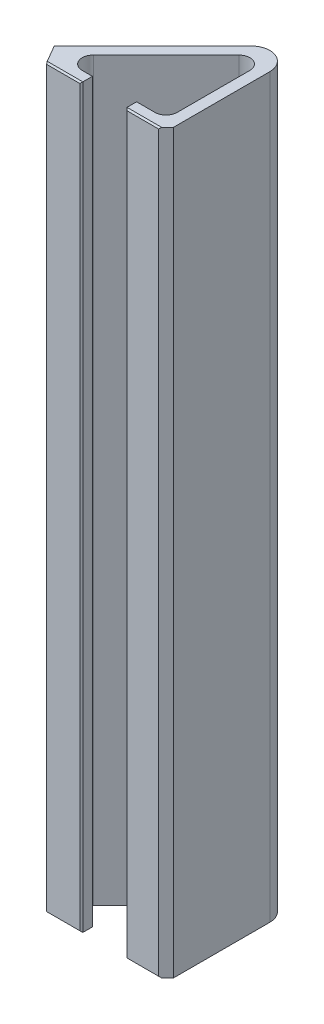
ISO-10303-21;
HEADER;
FILE_DESCRIPTION(('STEP AP214'),'2;1');
FILE_NAME('part.step','',(''),(''),'','','');
FILE_SCHEMA(('AUTOMOTIVE_DESIGN { 1 0 10303 214 1 1 1 1 }'));
ENDSEC;
DATA;
#1=APPLICATION_CONTEXT('core data for automotive mechanical design processes');
#2=APPLICATION_PROTOCOL_DEFINITION('international standard','automotive_design',2000,#1);
#3=PRODUCT_CONTEXT('',#1,'mechanical');
#4=PRODUCT('Part','Part','',(#3));
#5=PRODUCT_RELATED_PRODUCT_CATEGORY('part','',(#4));
#6=PRODUCT_DEFINITION_FORMATION('','',#4);
#7=PRODUCT_DEFINITION_CONTEXT('part definition',#1,'design');
#8=PRODUCT_DEFINITION('design','',#6,#7);
#9=PRODUCT_DEFINITION_SHAPE('','',#8);
#10=(LENGTH_UNIT() NAMED_UNIT(*) SI_UNIT(.MILLI.,.METRE.));
#11=(NAMED_UNIT(*) PLANE_ANGLE_UNIT() SI_UNIT($,.RADIAN.));
#12=(NAMED_UNIT(*) SI_UNIT($,.STERADIAN.) SOLID_ANGLE_UNIT());
#13=UNCERTAINTY_MEASURE_WITH_UNIT(LENGTH_MEASURE(1.E-05),#10,'distance_accuracy_value','');
#14=(GEOMETRIC_REPRESENTATION_CONTEXT(3) GLOBAL_UNCERTAINTY_ASSIGNED_CONTEXT((#13)) GLOBAL_UNIT_ASSIGNED_CONTEXT((#10,
#11,#12)) REPRESENTATION_CONTEXT('',''));
#15=CARTESIAN_POINT('',(0.,0.,0.));
#16=DIRECTION('',(0.,0.,1.));
#17=DIRECTION('',(1.,0.,0.));
#18=AXIS2_PLACEMENT_3D('',#15,#16,#17);
#19=CARTESIAN_POINT('',(-8.,200.,0.));
#20=DIRECTION('',(0.,0.,1.));
#21=DIRECTION('',(1.,0.,0.));
#22=AXIS2_PLACEMENT_3D('',#19,#20,#21);
#23=PLANE('',#22);
#24=DIRECTION('',(-1.,0.,0.));
#25=VECTOR('',#24,1.);
#26=CARTESIAN_POINT('',(-8.,200.,0.));
#27=LINE('',#26,#25);
#28=CARTESIAN_POINT('',(-3.,200.,0.));
#29=VERTEX_POINT('',#28);
#30=CARTESIAN_POINT('',(-8.,200.,0.));
#31=VERTEX_POINT('',#30);
#32=EDGE_CURVE('E177',#29,#31,#27,.T.);
#33=ORIENTED_EDGE('',*,*,#32,.F.);
#34=DIRECTION('',(0.,-1.,0.));
#35=VECTOR('',#34,1.);
#36=CARTESIAN_POINT('',(-3.,0.,0.));
#37=LINE('',#36,#35);
#38=CARTESIAN_POINT('',(-3.,0.,0.));
#39=VERTEX_POINT('',#38);
#40=EDGE_CURVE('E203',#29,#39,#37,.T.);
#41=ORIENTED_EDGE('',*,*,#40,.T.);
#42=DIRECTION('',(-1.,0.,0.));
#43=VECTOR('',#42,1.);
#44=CARTESIAN_POINT('',(-8.,0.,0.));
#45=LINE('',#44,#43);
#46=CARTESIAN_POINT('',(-8.,0.,0.));
#47=VERTEX_POINT('',#46);
#48=EDGE_CURVE('E201',#39,#47,#45,.T.);
#49=ORIENTED_EDGE('',*,*,#48,.T.);
#50=DIRECTION('',(0.,-1.,0.));
#51=VECTOR('',#50,1.);
#52=CARTESIAN_POINT('',(-8.,200.,0.));
#53=LINE('',#52,#51);
#54=EDGE_CURVE('E195',#31,#47,#53,.T.);
#55=ORIENTED_EDGE('',*,*,#54,.F.);
#56=EDGE_LOOP('',(#33,#41,#49,#55));
#57=FACE_BOUND('',#56,.T.);
#58=ADVANCED_FACE('F36',(#57),#23,.F.);
#59=CARTESIAN_POINT('',(-8.,200.,0.));
#60=DIRECTION('',(1.,0.,0.));
#61=DIRECTION('',(0.,0.,-1.));
#62=AXIS2_PLACEMENT_3D('',#59,#60,#61);
#63=PLANE('',#62);
#64=DIRECTION('',(0.,0.,1.));
#65=VECTOR('',#64,1.);
#66=CARTESIAN_POINT('',(-8.,0.,0.));
#67=LINE('',#66,#65);
#68=CARTESIAN_POINT('',(-8.,0.,2.59999999999999));
#69=VERTEX_POINT('',#68);
#70=EDGE_CURVE('E346',#47,#69,#67,.T.);
#71=ORIENTED_EDGE('',*,*,#70,.T.);
#72=DIRECTION('',(0.,1.,0.));
#73=VECTOR('',#72,1.);
#74=CARTESIAN_POINT('',(-8.,200.,2.59999999999999));
#75=LINE('',#74,#73);
#76=CARTESIAN_POINT('',(-8.,200.,2.59999999999999));
#77=VERTEX_POINT('',#76);
#78=EDGE_CURVE('E197',#69,#77,#75,.T.);
#79=ORIENTED_EDGE('',*,*,#78,.T.);
#80=DIRECTION('',(0.,0.,1.));
#81=VECTOR('',#80,1.);
#82=CARTESIAN_POINT('',(-8.,200.,0.));
#83=LINE('',#82,#81);
#84=EDGE_CURVE('E180',#31,#77,#83,.T.);
#85=ORIENTED_EDGE('',*,*,#84,.F.);
#86=ORIENTED_EDGE('',*,*,#54,.T.);
#87=EDGE_LOOP('',(#71,#79,#85,#86));
#88=FACE_BOUND('',#87,.T.);
#89=ADVANCED_FACE('F194',(#88),#63,.F.);
#90=CARTESIAN_POINT('',(-8.,200.,3.));
#91=DIRECTION('',(0.,0.,-1.));
#92=DIRECTION('',(-1.,0.,0.));
#93=AXIS2_PLACEMENT_3D('',#90,#91,#92);
#94=PLANE('',#93);
#95=DIRECTION('',(0.,-1.,0.));
#96=VECTOR('',#95,1.);
#97=CARTESIAN_POINT('',(-7.59999999999999,200.,3.));
#98=LINE('',#97,#96);
#99=CARTESIAN_POINT('',(-7.59999999999999,199.6,3.));
#100=VERTEX_POINT('',#99);
#101=CARTESIAN_POINT('',(-7.59999999999999,0.400000000000011,3.));
#102=VERTEX_POINT('',#101);
#103=EDGE_CURVE('E267',#100,#102,#98,.T.);
#104=ORIENTED_EDGE('',*,*,#103,.T.);
#105=DIRECTION('',(1.,0.,0.));
#106=VECTOR('',#105,1.);
#107=CARTESIAN_POINT('',(-8.,0.400000000000011,3.));
#108=LINE('',#107,#106);
#109=CARTESIAN_POINT('',(0.999999999999997,0.400000000000011,3.));
#110=VERTEX_POINT('',#109);
#111=EDGE_CURVE('E271',#102,#110,#108,.T.);
#112=ORIENTED_EDGE('',*,*,#111,.T.);
#113=DIRECTION('',(0.,1.,0.));
#114=VECTOR('',#113,1.);
#115=CARTESIAN_POINT('',(0.999999999999997,200.,3.));
#116=LINE('',#115,#114);
#117=CARTESIAN_POINT('',(0.999999999999997,199.6,3.));
#118=VERTEX_POINT('',#117);
#119=EDGE_CURVE('E262',#110,#118,#116,.T.);
#120=ORIENTED_EDGE('',*,*,#119,.T.);
#121=DIRECTION('',(-1.,0.,0.));
#122=VECTOR('',#121,1.);
#123=CARTESIAN_POINT('',(-8.,199.6,3.));
#124=LINE('',#123,#122);
#125=EDGE_CURVE('E269',#118,#100,#124,.T.);
#126=ORIENTED_EDGE('',*,*,#125,.T.);
#127=EDGE_LOOP('',(#104,#112,#120,#126));
#128=FACE_BOUND('',#127,.T.);
#129=ADVANCED_FACE('F406',(#128),#94,.F.);
#130=CARTESIAN_POINT('',(3.,200.,3.));
#131=DIRECTION('',(-1.,0.,0.));
#132=DIRECTION('',(0.,0.,1.));
#133=AXIS2_PLACEMENT_3D('',#130,#131,#132);
#134=PLANE('',#133);
#135=DIRECTION('',(0.,0.,-1.));
#136=VECTOR('',#135,1.);
#137=CARTESIAN_POINT('',(3.,200.,3.));
#138=LINE('',#137,#136);
#139=CARTESIAN_POINT('',(3.,200.,0.999999999999998));
#140=VERTEX_POINT('',#139);
#141=CARTESIAN_POINT('',(3.,200.,-25.1715728752538));
#142=VERTEX_POINT('',#141);
#143=EDGE_CURVE('E198',#140,#142,#138,.T.);
#144=ORIENTED_EDGE('',*,*,#143,.F.);
#145=DIRECTION('',(0.,-1.,0.));
#146=VECTOR('',#145,1.);
#147=CARTESIAN_POINT('',(3.,200.,0.999999999999998));
#148=LINE('',#147,#146);
#149=CARTESIAN_POINT('',(3.,0.,0.999999999999998));
#150=VERTEX_POINT('',#149);
#151=EDGE_CURVE('E256',#140,#150,#148,.T.);
#152=ORIENTED_EDGE('',*,*,#151,.T.);
#153=DIRECTION('',(0.,0.,-1.));
#154=VECTOR('',#153,1.);
#155=CARTESIAN_POINT('',(3.,0.,3.));
#156=LINE('',#155,#154);
#157=CARTESIAN_POINT('',(3.,0.,-25.1715728752538));
#158=VERTEX_POINT('',#157);
#159=EDGE_CURVE('E332',#150,#158,#156,.T.);
#160=ORIENTED_EDGE('',*,*,#159,.T.);
#161=DIRECTION('',(0.,-1.,0.));
#162=VECTOR('',#161,1.);
#163=CARTESIAN_POINT('',(3.,200.,-25.1715728752538));
#164=LINE('',#163,#162);
#165=EDGE_CURVE('E241',#158,#142,#164,.F.);
#166=ORIENTED_EDGE('',*,*,#165,.T.);
#167=EDGE_LOOP('',(#144,#152,#160,#166));
#168=FACE_BOUND('',#167,.T.);
#169=ADVANCED_FACE('F354',(#168),#134,.F.);
#170=CARTESIAN_POINT('',(3.,200.,-37.2426406871193));
#171=DIRECTION('',(0.707106781186548,0.,0.707106781186548));
#172=DIRECTION('',(0.707106781186548,0.,-0.707106781186548));
#173=AXIS2_PLACEMENT_3D('',#170,#171,#172);
#174=PLANE('',#173);
#175=DIRECTION('',(-0.707106781186548,0.,0.707106781186548));
#176=VECTOR('',#175,1.);
#177=CARTESIAN_POINT('',(3.,0.,-37.2426406871193));
#178=LINE('',#177,#176);
#179=CARTESIAN_POINT('',(-5.53553390593274,0.,-28.7071067811865));
#180=VERTEX_POINT('',#179);
#181=CARTESIAN_POINT('',(-32.2928932188134,0.,-1.94974746830583));
#182=VERTEX_POINT('',#181);
#183=EDGE_CURVE('E328',#180,#182,#178,.T.);
#184=ORIENTED_EDGE('',*,*,#183,.T.);
#185=DIRECTION('',(0.,1.,0.));
#186=VECTOR('',#185,1.);
#187=CARTESIAN_POINT('',(-32.2928932188134,200.,-1.94974746830584));
#188=LINE('',#187,#186);
#189=CARTESIAN_POINT('',(-32.2928932188134,200.,-1.94974746830583));
#190=VERTEX_POINT('',#189);
#191=EDGE_CURVE('E251',#182,#190,#188,.T.);
#192=ORIENTED_EDGE('',*,*,#191,.T.);
#193=DIRECTION('',(-0.707106781186548,0.,0.707106781186548));
#194=VECTOR('',#193,1.);
#195=CARTESIAN_POINT('',(3.,200.,-37.2426406871193));
#196=LINE('',#195,#194);
#197=CARTESIAN_POINT('',(-5.53553390593274,200.,-28.7071067811865));
#198=VERTEX_POINT('',#197);
#199=EDGE_CURVE('E363',#198,#190,#196,.T.);
#200=ORIENTED_EDGE('',*,*,#199,.F.);
#201=DIRECTION('',(0.,-1.,0.));
#202=VECTOR('',#201,1.);
#203=CARTESIAN_POINT('',(-5.53553390593274,200.,-28.7071067811865));
#204=LINE('',#203,#202);
#205=EDGE_CURVE('E235',#198,#180,#204,.T.);
#206=ORIENTED_EDGE('',*,*,#205,.T.);
#207=EDGE_LOOP('',(#184,#192,#200,#206));
#208=FACE_BOUND('',#207,.T.);
#209=ADVANCED_FACE('F365',(#208),#174,.F.);
#210=CARTESIAN_POINT('',(-37.2426406871193,200.,3.));
#211=DIRECTION('',(0.,0.,-1.));
#212=DIRECTION('',(-1.,0.,0.));
#213=AXIS2_PLACEMENT_3D('',#210,#211,#212);
#214=PLANE('',#213);
#215=DIRECTION('',(0.,-1.,0.));
#216=VECTOR('',#215,1.);
#217=CARTESIAN_POINT('',(-29.4351551855664,200.,3.));
#218=LINE('',#217,#216);
#219=CARTESIAN_POINT('',(-29.4351551855664,199.6,3.));
#220=VERTEX_POINT('',#219);
#221=CARTESIAN_POINT('',(-29.4351551855664,0.400000000000011,3.));
#222=VERTEX_POINT('',#221);
#223=EDGE_CURVE('E246',#220,#222,#218,.T.);
#224=ORIENTED_EDGE('',*,*,#223,.T.);
#225=DIRECTION('',(1.,0.,0.));
#226=VECTOR('',#225,1.);
#227=CARTESIAN_POINT('',(-37.2426406871193,0.400000000000011,3.));
#228=LINE('',#227,#226);
#229=CARTESIAN_POINT('',(-20.4,0.400000000000011,3.));
#230=VERTEX_POINT('',#229);
#231=EDGE_CURVE('E290',#222,#230,#228,.T.);
#232=ORIENTED_EDGE('',*,*,#231,.T.);
#233=DIRECTION('',(0.,1.,0.));
#234=VECTOR('',#233,1.);
#235=CARTESIAN_POINT('',(-20.4,200.,3.));
#236=LINE('',#235,#234);
#237=CARTESIAN_POINT('',(-20.4,199.6,3.));
#238=VERTEX_POINT('',#237);
#239=EDGE_CURVE('E54',#230,#238,#236,.T.);
#240=ORIENTED_EDGE('',*,*,#239,.T.);
#241=DIRECTION('',(-1.,0.,0.));
#242=VECTOR('',#241,1.);
#243=CARTESIAN_POINT('',(-29.4351551855664,199.6,3.));
#244=LINE('',#243,#242);
#245=EDGE_CURVE('E288',#238,#220,#244,.T.);
#246=ORIENTED_EDGE('',*,*,#245,.T.);
#247=EDGE_LOOP('',(#224,#232,#240,#246));
#248=FACE_BOUND('',#247,.T.);
#249=ADVANCED_FACE('F309',(#248),#214,.F.);
#250=CARTESIAN_POINT('',(-20.,200.,0.));
#251=DIRECTION('',(-1.,0.,0.));
#252=DIRECTION('',(0.,0.,1.));
#253=AXIS2_PLACEMENT_3D('',#250,#251,#252);
#254=PLANE('',#253);
#255=DIRECTION('',(0.,0.,-1.));
#256=VECTOR('',#255,1.);
#257=CARTESIAN_POINT('',(-20.,200.,0.));
#258=LINE('',#257,#256);
#259=CARTESIAN_POINT('',(-20.,200.,2.60000000000002));
#260=VERTEX_POINT('',#259);
#261=CARTESIAN_POINT('',(-20.,200.,0.));
#262=VERTEX_POINT('',#261);
#263=EDGE_CURVE('E366',#260,#262,#258,.T.);
#264=ORIENTED_EDGE('',*,*,#263,.F.);
#265=DIRECTION('',(0.,-1.,0.));
#266=VECTOR('',#265,1.);
#267=CARTESIAN_POINT('',(-20.,200.,2.60000000000002));
#268=LINE('',#267,#266);
#269=CARTESIAN_POINT('',(-20.,0.,2.60000000000002));
#270=VERTEX_POINT('',#269);
#271=EDGE_CURVE('E11',#260,#270,#268,.T.);
#272=ORIENTED_EDGE('',*,*,#271,.T.);
#273=DIRECTION('',(0.,0.,-1.));
#274=VECTOR('',#273,1.);
#275=CARTESIAN_POINT('',(-20.,0.,0.));
#276=LINE('',#275,#274);
#277=CARTESIAN_POINT('',(-20.,0.,0.));
#278=VERTEX_POINT('',#277);
#279=EDGE_CURVE('E323',#270,#278,#276,.T.);
#280=ORIENTED_EDGE('',*,*,#279,.T.);
#281=DIRECTION('',(0.,-1.,0.));
#282=VECTOR('',#281,1.);
#283=CARTESIAN_POINT('',(-20.,200.,0.));
#284=LINE('',#283,#282);
#285=EDGE_CURVE('E204',#262,#278,#284,.T.);
#286=ORIENTED_EDGE('',*,*,#285,.F.);
#287=EDGE_LOOP('',(#264,#272,#280,#286));
#288=FACE_BOUND('',#287,.T.);
#289=ADVANCED_FACE('F392',(#288),#254,.F.);
#290=CARTESIAN_POINT('',(-30.,200.,0.));
#291=DIRECTION('',(0.,0.,1.));
#292=DIRECTION('',(1.,0.,0.));
#293=AXIS2_PLACEMENT_3D('',#290,#291,#292);
#294=PLANE('',#293);
#295=DIRECTION('',(-1.,0.,0.));
#296=VECTOR('',#295,1.);
#297=CARTESIAN_POINT('',(-30.,0.,0.));
#298=LINE('',#297,#296);
#299=CARTESIAN_POINT('',(-22.7573593128807,0.,0.));
#300=VERTEX_POINT('',#299);
#301=EDGE_CURVE('E325',#278,#300,#298,.T.);
#302=ORIENTED_EDGE('',*,*,#301,.T.);
#303=DIRECTION('',(0.,-1.,0.));
#304=VECTOR('',#303,1.);
#305=CARTESIAN_POINT('',(-22.7573593128807,200.,0.));
#306=LINE('',#305,#304);
#307=CARTESIAN_POINT('',(-22.7573593128807,200.,0.));
#308=VERTEX_POINT('',#307);
#309=EDGE_CURVE('E222',#300,#308,#306,.F.);
#310=ORIENTED_EDGE('',*,*,#309,.T.);
#311=DIRECTION('',(-1.,0.,0.));
#312=VECTOR('',#311,1.);
#313=CARTESIAN_POINT('',(-30.,200.,0.));
#314=LINE('',#313,#312);
#315=EDGE_CURVE('E368',#262,#308,#314,.T.);
#316=ORIENTED_EDGE('',*,*,#315,.F.);
#317=ORIENTED_EDGE('',*,*,#285,.T.);
#318=EDGE_LOOP('',(#302,#310,#316,#317));
#319=FACE_BOUND('',#318,.T.);
#320=ADVANCED_FACE('F389',(#319),#294,.F.);
#321=CARTESIAN_POINT('',(0.,200.,-30.));
#322=DIRECTION('',(-0.707106781186547,0.,-0.707106781186547));
#323=DIRECTION('',(-0.707106781186548,0.,0.707106781186548));
#324=AXIS2_PLACEMENT_3D('',#321,#322,#323);
#325=PLANE('',#324);
#326=DIRECTION('',(0.707106781186547,0.,-0.707106781186547));
#327=VECTOR('',#326,1.);
#328=CARTESIAN_POINT('',(0.,200.,-30.));
#329=LINE('',#328,#327);
#330=CARTESIAN_POINT('',(-24.8786796564404,200.,-5.12132034355965));
#331=VERTEX_POINT('',#330);
#332=CARTESIAN_POINT('',(-5.12132034355964,200.,-24.8786796564404));
#333=VERTEX_POINT('',#332);
#334=EDGE_CURVE('E373',#331,#333,#329,.T.);
#335=ORIENTED_EDGE('',*,*,#334,.F.);
#336=DIRECTION('',(0.,-1.,0.));
#337=VECTOR('',#336,1.);
#338=CARTESIAN_POINT('',(-24.8786796564404,0.,-5.12132034355964));
#339=LINE('',#338,#337);
#340=CARTESIAN_POINT('',(-24.8786796564404,0.,-5.12132034355965));
#341=VERTEX_POINT('',#340);
#342=EDGE_CURVE('E219',#331,#341,#339,.T.);
#343=ORIENTED_EDGE('',*,*,#342,.T.);
#344=DIRECTION('',(0.707106781186547,0.,-0.707106781186547));
#345=VECTOR('',#344,1.);
#346=CARTESIAN_POINT('',(0.,0.,-30.));
#347=LINE('',#346,#345);
#348=CARTESIAN_POINT('',(-5.12132034355964,0.,-24.8786796564404));
#349=VERTEX_POINT('',#348);
#350=EDGE_CURVE('E330',#341,#349,#347,.T.);
#351=ORIENTED_EDGE('',*,*,#350,.T.);
#352=DIRECTION('',(0.,-1.,0.));
#353=VECTOR('',#352,1.);
#354=CARTESIAN_POINT('',(-5.12132034355964,200.,-24.8786796564404));
#355=LINE('',#354,#353);
#356=EDGE_CURVE('E217',#349,#333,#355,.F.);
#357=ORIENTED_EDGE('',*,*,#356,.T.);
#358=EDGE_LOOP('',(#335,#343,#351,#357));
#359=FACE_BOUND('',#358,.T.);
#360=ADVANCED_FACE('F382',(#359),#325,.F.);
#361=CARTESIAN_POINT('',(0.,200.,0.));
#362=DIRECTION('',(1.,0.,0.));
#363=DIRECTION('',(0.,0.,-1.));
#364=AXIS2_PLACEMENT_3D('',#361,#362,#363);
#365=PLANE('',#364);
#366=DIRECTION('',(0.,0.,1.));
#367=VECTOR('',#366,1.);
#368=CARTESIAN_POINT('',(0.,0.,0.));
#369=LINE('',#368,#367);
#370=CARTESIAN_POINT('',(0.,0.,-22.7573593128807));
#371=VERTEX_POINT('',#370);
#372=CARTESIAN_POINT('',(0.,0.,-3.));
#373=VERTEX_POINT('',#372);
#374=EDGE_CURVE('E189',#371,#373,#369,.T.);
#375=ORIENTED_EDGE('',*,*,#374,.T.);
#376=DIRECTION('',(0.,-1.,0.));
#377=VECTOR('',#376,1.);
#378=CARTESIAN_POINT('',(0.,200.,-3.));
#379=LINE('',#378,#377);
#380=CARTESIAN_POINT('',(0.,200.,-3.));
#381=VERTEX_POINT('',#380);
#382=EDGE_CURVE('E215',#373,#381,#379,.F.);
#383=ORIENTED_EDGE('',*,*,#382,.T.);
#384=DIRECTION('',(0.,0.,1.));
#385=VECTOR('',#384,1.);
#386=CARTESIAN_POINT('',(0.,200.,0.));
#387=LINE('',#386,#385);
#388=CARTESIAN_POINT('',(0.,200.,-22.7573593128807));
#389=VERTEX_POINT('',#388);
#390=EDGE_CURVE('E209',#389,#381,#387,.T.);
#391=ORIENTED_EDGE('',*,*,#390,.F.);
#392=DIRECTION('',(0.,-1.,0.));
#393=VECTOR('',#392,1.);
#394=CARTESIAN_POINT('',(0.,0.,-22.7573593128807));
#395=LINE('',#394,#393);
#396=EDGE_CURVE('E206',#389,#371,#395,.T.);
#397=ORIENTED_EDGE('',*,*,#396,.T.);
#398=EDGE_LOOP('',(#375,#383,#391,#397));
#399=FACE_BOUND('',#398,.T.);
#400=ADVANCED_FACE('F341',(#399),#365,.F.);
#401=CARTESIAN_POINT('',(0.,200.,0.));
#402=DIRECTION('',(0.,1.,0.));
#403=DIRECTION('',(0.,0.,1.));
#404=AXIS2_PLACEMENT_3D('',#401,#402,#403);
#405=PLANE('',#404);
#406=ORIENTED_EDGE('',*,*,#84,.T.);
#407=DIRECTION('',(1.,0.,0.));
#408=VECTOR('',#407,1.);
#409=CARTESIAN_POINT('',(0.999999999999997,200.,2.59999999999999));
#410=LINE('',#409,#408);
#411=CARTESIAN_POINT('',(1.40000000000001,200.,2.59999999999999));
#412=VERTEX_POINT('',#411);
#413=EDGE_CURVE('E284',#77,#412,#410,.T.);
#414=ORIENTED_EDGE('',*,*,#413,.T.);
#415=DIRECTION('',(-0.707106781186548,0.,0.707106781186547));
#416=VECTOR('',#415,1.);
#417=CARTESIAN_POINT('',(2.,200.,2.));
#418=LINE('',#417,#416);
#419=EDGE_CURVE('E265',#412,#140,#418,.F.);
#420=ORIENTED_EDGE('',*,*,#419,.T.);
#421=ORIENTED_EDGE('',*,*,#143,.T.);
#422=CARTESIAN_POINT('',(-2.,200.,-25.1715728752538));
#423=DIRECTION('',(0.,1.,0.));
#424=DIRECTION('',(0.,0.,1.));
#425=AXIS2_PLACEMENT_3D('',#422,#423,#424);
#426=CIRCLE('',#425,5.);
#427=EDGE_CURVE('E244',#142,#198,#426,.T.);
#428=ORIENTED_EDGE('',*,*,#427,.T.);
#429=ORIENTED_EDGE('',*,*,#199,.T.);
#430=DIRECTION('',(-0.5,0.,-0.866025403784439));
#431=VECTOR('',#430,1.);
#432=CARTESIAN_POINT('',(-23.3754044948514,200.,13.4957960775189));
#433=LINE('',#432,#431);
#434=CARTESIAN_POINT('',(-29.6660952932422,200.,2.60000000000002));
#435=VERTEX_POINT('',#434);
#436=EDGE_CURVE('E253',#190,#435,#433,.F.);
#437=ORIENTED_EDGE('',*,*,#436,.T.);
#438=DIRECTION('',(1.,0.,0.));
#439=VECTOR('',#438,1.);
#440=CARTESIAN_POINT('',(-20.,200.,2.60000000000002));
#441=LINE('',#440,#439);
#442=EDGE_CURVE('E282',#435,#260,#441,.T.);
#443=ORIENTED_EDGE('',*,*,#442,.T.);
#444=ORIENTED_EDGE('',*,*,#263,.T.);
#445=ORIENTED_EDGE('',*,*,#315,.T.);
#446=CARTESIAN_POINT('',(-22.7573593128807,200.,-3.));
#447=DIRECTION('',(0.,1.,0.));
#448=DIRECTION('',(0.,0.,1.));
#449=AXIS2_PLACEMENT_3D('',#446,#447,#448);
#450=CIRCLE('',#449,3.);
#451=EDGE_CURVE('E229',#308,#331,#450,.F.);
#452=ORIENTED_EDGE('',*,*,#451,.T.);
#453=ORIENTED_EDGE('',*,*,#334,.T.);
#454=CARTESIAN_POINT('',(-3.,200.,-22.7573593128807));
#455=DIRECTION('',(0.,1.,0.));
#456=DIRECTION('',(0.,0.,1.));
#457=AXIS2_PLACEMENT_3D('',#454,#455,#456);
#458=CIRCLE('',#457,3.);
#459=EDGE_CURVE('E233',#333,#389,#458,.F.);
#460=ORIENTED_EDGE('',*,*,#459,.T.);
#461=ORIENTED_EDGE('',*,*,#390,.T.);
#462=CARTESIAN_POINT('',(-3.,200.,-3.));
#463=DIRECTION('',(0.,1.,0.));
#464=DIRECTION('',(0.,0.,1.));
#465=AXIS2_PLACEMENT_3D('',#462,#463,#464);
#466=CIRCLE('',#465,3.);
#467=EDGE_CURVE('E184',#381,#29,#466,.F.);
#468=ORIENTED_EDGE('',*,*,#467,.T.);
#469=ORIENTED_EDGE('',*,*,#32,.T.);
#470=EDGE_LOOP('',(#406,#414,#420,#421,#428,#429,#437,#443,#444,#445,#452,#453,#460,#461,#468,#469));
#471=FACE_BOUND('',#470,.T.);
#472=ADVANCED_FACE('F179',(#471),#405,.T.);
#473=CARTESIAN_POINT('',(0.,0.,0.));
#474=DIRECTION('',(0.,1.,0.));
#475=DIRECTION('',(0.,0.,1.));
#476=AXIS2_PLACEMENT_3D('',#473,#474,#475);
#477=PLANE('',#476);
#478=DIRECTION('',(0.707106781186548,0.,-0.707106781186547));
#479=VECTOR('',#478,1.);
#480=CARTESIAN_POINT('',(3.,0.,0.999999999999998));
#481=LINE('',#480,#479);
#482=CARTESIAN_POINT('',(1.40000000000001,0.,2.59999999999999));
#483=VERTEX_POINT('',#482);
#484=EDGE_CURVE('E259',#150,#483,#481,.F.);
#485=ORIENTED_EDGE('',*,*,#484,.T.);
#486=DIRECTION('',(-1.,0.,0.));
#487=VECTOR('',#486,1.);
#488=CARTESIAN_POINT('',(0.,0.,2.59999999999999));
#489=LINE('',#488,#487);
#490=EDGE_CURVE('E280',#483,#69,#489,.T.);
#491=ORIENTED_EDGE('',*,*,#490,.T.);
#492=ORIENTED_EDGE('',*,*,#70,.F.);
#493=ORIENTED_EDGE('',*,*,#48,.F.);
#494=CARTESIAN_POINT('',(-3.,0.,-3.));
#495=DIRECTION('',(0.,1.,0.));
#496=DIRECTION('',(0.,0.,1.));
#497=AXIS2_PLACEMENT_3D('',#494,#495,#496);
#498=CIRCLE('',#497,3.);
#499=EDGE_CURVE('E224',#39,#373,#498,.T.);
#500=ORIENTED_EDGE('',*,*,#499,.T.);
#501=ORIENTED_EDGE('',*,*,#374,.F.);
#502=CARTESIAN_POINT('',(-3.,0.,-22.7573593128807));
#503=DIRECTION('',(0.,1.,0.));
#504=DIRECTION('',(0.,0.,1.));
#505=AXIS2_PLACEMENT_3D('',#502,#503,#504);
#506=CIRCLE('',#505,3.);
#507=EDGE_CURVE('E231',#371,#349,#506,.T.);
#508=ORIENTED_EDGE('',*,*,#507,.T.);
#509=ORIENTED_EDGE('',*,*,#350,.F.);
#510=CARTESIAN_POINT('',(-22.7573593128807,0.,-3.));
#511=DIRECTION('',(0.,1.,0.));
#512=DIRECTION('',(0.,0.,1.));
#513=AXIS2_PLACEMENT_3D('',#510,#511,#512);
#514=CIRCLE('',#513,3.);
#515=EDGE_CURVE('E227',#341,#300,#514,.T.);
#516=ORIENTED_EDGE('',*,*,#515,.T.);
#517=ORIENTED_EDGE('',*,*,#301,.F.);
#518=ORIENTED_EDGE('',*,*,#279,.F.);
#519=DIRECTION('',(-1.,0.,0.));
#520=VECTOR('',#519,1.);
#521=CARTESIAN_POINT('',(0.,0.,2.60000000000002));
#522=LINE('',#521,#520);
#523=CARTESIAN_POINT('',(-29.6660952932422,0.,2.60000000000002));
#524=VERTEX_POINT('',#523);
#525=EDGE_CURVE('E278',#270,#524,#522,.T.);
#526=ORIENTED_EDGE('',*,*,#525,.T.);
#527=DIRECTION('',(0.5,0.,0.866025403784439));
#528=VECTOR('',#527,1.);
#529=CARTESIAN_POINT('',(-29.4351551855664,0.,3.));
#530=LINE('',#529,#528);
#531=EDGE_CURVE('E249',#524,#182,#530,.F.);
#532=ORIENTED_EDGE('',*,*,#531,.T.);
#533=ORIENTED_EDGE('',*,*,#183,.F.);
#534=CARTESIAN_POINT('',(-2.,0.,-25.1715728752538));
#535=DIRECTION('',(0.,1.,0.));
#536=DIRECTION('',(0.,0.,1.));
#537=AXIS2_PLACEMENT_3D('',#534,#535,#536);
#538=CIRCLE('',#537,5.);
#539=EDGE_CURVE('E238',#180,#158,#538,.F.);
#540=ORIENTED_EDGE('',*,*,#539,.T.);
#541=ORIENTED_EDGE('',*,*,#159,.F.);
#542=EDGE_LOOP('',(#485,#491,#492,#493,#500,#501,#508,#509,#516,#517,#518,#526,#532,#533,#540,#541));
#543=FACE_BOUND('',#542,.T.);
#544=ADVANCED_FACE('F319',(#543),#477,.F.);
#545=CARTESIAN_POINT('',(-3.,200.,-3.));
#546=DIRECTION('',(0.,1.,0.));
#547=DIRECTION('',(0.,0.,1.));
#548=AXIS2_PLACEMENT_3D('',#545,#546,#547);
#549=CYLINDRICAL_SURFACE('',#548,3.);
#550=ORIENTED_EDGE('',*,*,#467,.F.);
#551=ORIENTED_EDGE('',*,*,#382,.F.);
#552=ORIENTED_EDGE('',*,*,#499,.F.);
#553=ORIENTED_EDGE('',*,*,#40,.F.);
#554=EDGE_LOOP('',(#550,#551,#552,#553));
#555=FACE_BOUND('',#554,.T.);
#556=ADVANCED_FACE('F345',(#555),#549,.F.);
#557=CARTESIAN_POINT('',(-22.7573593128807,200.,-3.));
#558=DIRECTION('',(0.,1.,0.));
#559=DIRECTION('',(0.,0.,1.));
#560=AXIS2_PLACEMENT_3D('',#557,#558,#559);
#561=CYLINDRICAL_SURFACE('',#560,3.);
#562=ORIENTED_EDGE('',*,*,#451,.F.);
#563=ORIENTED_EDGE('',*,*,#309,.F.);
#564=ORIENTED_EDGE('',*,*,#515,.F.);
#565=ORIENTED_EDGE('',*,*,#342,.F.);
#566=EDGE_LOOP('',(#562,#563,#564,#565));
#567=FACE_BOUND('',#566,.T.);
#568=ADVANCED_FACE('F386',(#567),#561,.F.);
#569=CARTESIAN_POINT('',(-3.,200.,-22.7573593128807));
#570=DIRECTION('',(0.,1.,0.));
#571=DIRECTION('',(0.,0.,1.));
#572=AXIS2_PLACEMENT_3D('',#569,#570,#571);
#573=CYLINDRICAL_SURFACE('',#572,3.);
#574=ORIENTED_EDGE('',*,*,#459,.F.);
#575=ORIENTED_EDGE('',*,*,#356,.F.);
#576=ORIENTED_EDGE('',*,*,#507,.F.);
#577=ORIENTED_EDGE('',*,*,#396,.F.);
#578=EDGE_LOOP('',(#574,#575,#576,#577));
#579=FACE_BOUND('',#578,.T.);
#580=ADVANCED_FACE('F378',(#579),#573,.F.);
#581=CARTESIAN_POINT('',(-2.,200.,-25.1715728752538));
#582=DIRECTION('',(0.,-1.,0.));
#583=DIRECTION('',(0.,0.,-1.));
#584=AXIS2_PLACEMENT_3D('',#581,#582,#583);
#585=CYLINDRICAL_SURFACE('',#584,5.);
#586=ORIENTED_EDGE('',*,*,#427,.F.);
#587=ORIENTED_EDGE('',*,*,#165,.F.);
#588=ORIENTED_EDGE('',*,*,#539,.F.);
#589=ORIENTED_EDGE('',*,*,#205,.F.);
#590=EDGE_LOOP('',(#586,#587,#588,#589));
#591=FACE_BOUND('',#590,.T.);
#592=ADVANCED_FACE('F360',(#591),#585,.T.);
#593=CARTESIAN_POINT('',(-29.4351551855664,200.,3.));
#594=DIRECTION('',(0.866025403784439,0.,-0.5));
#595=DIRECTION('',(0.,-1.,0.));
#596=AXIS2_PLACEMENT_3D('',#593,#594,#595);
#597=PLANE('',#596);
#598=ORIENTED_EDGE('',*,*,#531,.F.);
#599=DIRECTION('',(0.377964473009216,0.654653670708003,0.654653670707958));
#600=VECTOR('',#599,1.);
#601=CARTESIAN_POINT('',(19.9530364131124,85.942857142864,88.542857142858));
#602=LINE('',#601,#600);
#603=EDGE_CURVE('E46',#524,#222,#602,.T.);
#604=ORIENTED_EDGE('',*,*,#603,.T.);
#605=ORIENTED_EDGE('',*,*,#223,.F.);
#606=DIRECTION('',(0.377964473009216,-0.654653670708003,0.654653670707958));
#607=VECTOR('',#606,1.);
#608=CARTESIAN_POINT('',(-29.5341295174275,199.771428571429,2.82857142857142));
#609=LINE('',#608,#607);
#610=EDGE_CURVE('E292',#220,#435,#609,.F.);
#611=ORIENTED_EDGE('',*,*,#610,.T.);
#612=ORIENTED_EDGE('',*,*,#436,.F.);
#613=ORIENTED_EDGE('',*,*,#191,.F.);
#614=EDGE_LOOP('',(#598,#604,#605,#611,#612,#613));
#615=FACE_BOUND('',#614,.T.);
#616=ADVANCED_FACE('F312',(#615),#597,.F.);
#617=CARTESIAN_POINT('',(3.,200.,0.999999999999998));
#618=DIRECTION('',(-0.707106781186547,0.,-0.707106781186548));
#619=DIRECTION('',(0.,-1.,0.));
#620=AXIS2_PLACEMENT_3D('',#617,#618,#619);
#621=PLANE('',#620);
#622=ORIENTED_EDGE('',*,*,#119,.F.);
#623=DIRECTION('',(0.577350269189626,-0.577350269189626,-0.577350269189626));
#624=VECTOR('',#623,1.);
#625=CARTESIAN_POINT('',(-64.2,65.6,68.2));
#626=LINE('',#625,#624);
#627=EDGE_CURVE('E276',#110,#483,#626,.T.);
#628=ORIENTED_EDGE('',*,*,#627,.T.);
#629=ORIENTED_EDGE('',*,*,#484,.F.);
#630=ORIENTED_EDGE('',*,*,#151,.F.);
#631=ORIENTED_EDGE('',*,*,#419,.F.);
#632=DIRECTION('',(0.577350269189626,0.577350269189626,-0.577350269189626));
#633=VECTOR('',#632,1.);
#634=CARTESIAN_POINT('',(2.46666666666667,201.066666666667,1.53333333333333));
#635=LINE('',#634,#633);
#636=EDGE_CURVE('E274',#412,#118,#635,.F.);
#637=ORIENTED_EDGE('',*,*,#636,.T.);
#638=EDGE_LOOP('',(#622,#628,#629,#630,#631,#637));
#639=FACE_BOUND('',#638,.T.);
#640=ADVANCED_FACE('F424',(#639),#621,.F.);
#641=CARTESIAN_POINT('',(0.,200.,2.59999999999999));
#642=DIRECTION('',(0.,0.707106781186548,0.707106781186548));
#643=DIRECTION('',(-1.,0.,0.));
#644=AXIS2_PLACEMENT_3D('',#641,#642,#643);
#645=PLANE('',#644);
#646=ORIENTED_EDGE('',*,*,#636,.F.);
#647=ORIENTED_EDGE('',*,*,#413,.F.);
#648=DIRECTION('',(0.577350269189626,-0.577350269189626,0.577350269189626));
#649=VECTOR('',#648,1.);
#650=CARTESIAN_POINT('',(-7.73333333333333,199.733333333333,2.86666666666666));
#651=LINE('',#650,#649);
#652=EDGE_CURVE('E298',#100,#77,#651,.F.);
#653=ORIENTED_EDGE('',*,*,#652,.F.);
#654=ORIENTED_EDGE('',*,*,#125,.F.);
#655=EDGE_LOOP('',(#646,#647,#653,#654));
#656=FACE_BOUND('',#655,.T.);
#657=ADVANCED_FACE('F430',(#656),#645,.T.);
#658=CARTESIAN_POINT('',(-7.59999999999999,200.,3.));
#659=DIRECTION('',(0.707106781186548,0.,-0.707106781186548));
#660=DIRECTION('',(0.,-1.,0.));
#661=AXIS2_PLACEMENT_3D('',#658,#659,#660);
#662=PLANE('',#661);
#663=ORIENTED_EDGE('',*,*,#652,.T.);
#664=ORIENTED_EDGE('',*,*,#78,.F.);
#665=DIRECTION('',(0.577350269189626,0.577350269189626,0.577350269189626));
#666=VECTOR('',#665,1.);
#667=CARTESIAN_POINT('',(58.9333333333333,66.9333333333334,69.5333333333333));
#668=LINE('',#667,#666);
#669=EDGE_CURVE('E295',#102,#69,#668,.F.);
#670=ORIENTED_EDGE('',*,*,#669,.F.);
#671=ORIENTED_EDGE('',*,*,#103,.F.);
#672=EDGE_LOOP('',(#663,#664,#670,#671));
#673=FACE_BOUND('',#672,.T.);
#674=ADVANCED_FACE('F439',(#673),#662,.F.);
#675=CARTESIAN_POINT('',(-8.,0.400000000000011,3.));
#676=DIRECTION('',(0.,0.707106781186548,-0.707106781186548));
#677=DIRECTION('',(1.,0.,0.));
#678=AXIS2_PLACEMENT_3D('',#675,#676,#677);
#679=PLANE('',#678);
#680=ORIENTED_EDGE('',*,*,#669,.T.);
#681=ORIENTED_EDGE('',*,*,#490,.F.);
#682=ORIENTED_EDGE('',*,*,#627,.F.);
#683=ORIENTED_EDGE('',*,*,#111,.F.);
#684=EDGE_LOOP('',(#680,#681,#682,#683));
#685=FACE_BOUND('',#684,.T.);
#686=ADVANCED_FACE('F433',(#685),#679,.F.);
#687=CARTESIAN_POINT('',(0.,200.,2.60000000000002));
#688=DIRECTION('',(0.,0.707106781186523,0.707106781186572));
#689=DIRECTION('',(-1.,0.,0.));
#690=AXIS2_PLACEMENT_3D('',#687,#688,#689);
#691=PLANE('',#690);
#692=ORIENTED_EDGE('',*,*,#610,.F.);
#693=ORIENTED_EDGE('',*,*,#245,.F.);
#694=DIRECTION('',(0.577350269189639,0.577350269189639,-0.577350269189599));
#695=VECTOR('',#694,1.);
#696=CARTESIAN_POINT('',(-20.,200.,2.60000000000002));
#697=LINE('',#696,#695);
#698=EDGE_CURVE('E41',#260,#238,#697,.F.);
#699=ORIENTED_EDGE('',*,*,#698,.F.);
#700=ORIENTED_EDGE('',*,*,#442,.F.);
#701=EDGE_LOOP('',(#692,#693,#699,#700));
#702=FACE_BOUND('',#701,.T.);
#703=ADVANCED_FACE('F39',(#702),#691,.T.);
#704=CARTESIAN_POINT('',(-20.,200.,2.60000000000002));
#705=DIRECTION('',(-0.707106781186523,0.,-0.707106781186572));
#706=DIRECTION('',(0.,-1.,0.));
#707=AXIS2_PLACEMENT_3D('',#704,#705,#706);
#708=PLANE('',#707);
#709=ORIENTED_EDGE('',*,*,#698,.T.);
#710=ORIENTED_EDGE('',*,*,#239,.F.);
#711=DIRECTION('',(0.577350269189639,-0.577350269189639,-0.577350269189599));
#712=VECTOR('',#711,1.);
#713=CARTESIAN_POINT('',(-86.6666666666698,66.6666666666698,69.2666666666651));
#714=LINE('',#713,#712);
#715=EDGE_CURVE('E62',#270,#230,#714,.F.);
#716=ORIENTED_EDGE('',*,*,#715,.F.);
#717=ORIENTED_EDGE('',*,*,#271,.F.);
#718=EDGE_LOOP('',(#709,#710,#716,#717));
#719=FACE_BOUND('',#718,.T.);
#720=ADVANCED_FACE('F304',(#719),#708,.F.);
#721=CARTESIAN_POINT('',(-37.2426406871193,0.400000000000011,3.));
#722=DIRECTION('',(0.,0.707106781186523,-0.707106781186572));
#723=DIRECTION('',(1.,0.,0.));
#724=AXIS2_PLACEMENT_3D('',#721,#722,#723);
#725=PLANE('',#724);
#726=ORIENTED_EDGE('',*,*,#603,.F.);
#727=ORIENTED_EDGE('',*,*,#525,.F.);
#728=ORIENTED_EDGE('',*,*,#715,.T.);
#729=ORIENTED_EDGE('',*,*,#231,.F.);
#730=EDGE_LOOP('',(#726,#727,#728,#729));
#731=FACE_BOUND('',#730,.T.);
#732=ADVANCED_FACE('F316',(#731),#725,.F.);
#733=CLOSED_SHELL('',(#58,#89,#129,#169,#209,#249,#289,#320,#360,#400,#472,#544,#556,#568,#580,
#592,#616,#640,#657,#674,#686,#703,#720,#732));
#734=MANIFOLD_SOLID_BREP('B2',#733);
#735=ADVANCED_BREP_SHAPE_REPRESENTATION('',(#18,#734),#14);
#736=SHAPE_DEFINITION_REPRESENTATION(#9,#735);
ENDSEC;
END-ISO-10303-21;
